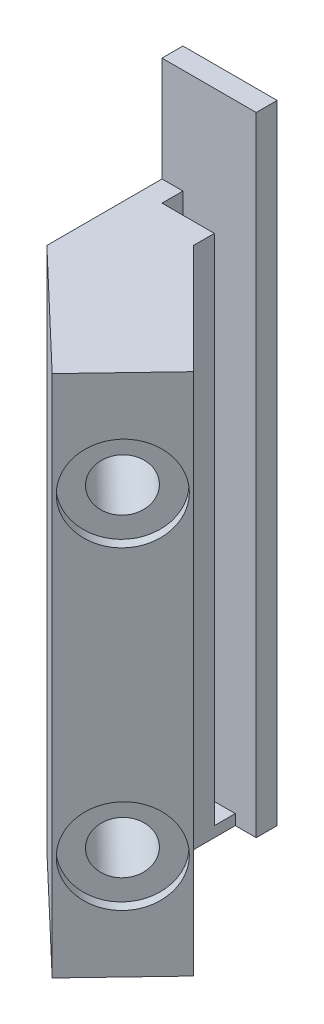
ISO-10303-21;
HEADER;
FILE_DESCRIPTION(('STEP AP214'),'2;1');
FILE_NAME('part.step','',(''),(''),'','','');
FILE_SCHEMA(('AUTOMOTIVE_DESIGN { 1 0 10303 214 1 1 1 1 }'));
ENDSEC;
DATA;
#1=APPLICATION_CONTEXT('core data for automotive mechanical design processes');
#2=APPLICATION_PROTOCOL_DEFINITION('international standard','automotive_design',2000,#1);
#3=PRODUCT_CONTEXT('',#1,'mechanical');
#4=PRODUCT('Part','Part','',(#3));
#5=PRODUCT_RELATED_PRODUCT_CATEGORY('part','',(#4));
#6=PRODUCT_DEFINITION_FORMATION('','',#4);
#7=PRODUCT_DEFINITION_CONTEXT('part definition',#1,'design');
#8=PRODUCT_DEFINITION('design','',#6,#7);
#9=PRODUCT_DEFINITION_SHAPE('','',#8);
#10=(LENGTH_UNIT() NAMED_UNIT(*) SI_UNIT(.MILLI.,.METRE.));
#11=(NAMED_UNIT(*) PLANE_ANGLE_UNIT() SI_UNIT($,.RADIAN.));
#12=(NAMED_UNIT(*) SI_UNIT($,.STERADIAN.) SOLID_ANGLE_UNIT());
#13=UNCERTAINTY_MEASURE_WITH_UNIT(LENGTH_MEASURE(1.E-05),#10,'distance_accuracy_value','');
#14=(GEOMETRIC_REPRESENTATION_CONTEXT(3) GLOBAL_UNCERTAINTY_ASSIGNED_CONTEXT((#13)) GLOBAL_UNIT_ASSIGNED_CONTEXT((#10,
#11,#12)) REPRESENTATION_CONTEXT('',''));
#15=CARTESIAN_POINT('',(0.,0.,0.));
#16=DIRECTION('',(0.,0.,1.));
#17=DIRECTION('',(1.,0.,0.));
#18=AXIS2_PLACEMENT_3D('',#15,#16,#17);
#19=CARTESIAN_POINT('',(0.,50.,0.));
#20=DIRECTION('',(0.,-1.,0.));
#21=DIRECTION('',(0.,0.,-1.));
#22=AXIS2_PLACEMENT_3D('',#19,#20,#21);
#23=PLANE('',#22);
#24=DIRECTION('',(1.,0.,0.));
#25=VECTOR('',#24,1.);
#26=CARTESIAN_POINT('',(9.,50.,2.));
#27=LINE('',#26,#25);
#28=CARTESIAN_POINT('',(0.,50.,2.));
#29=VERTEX_POINT('',#28);
#30=CARTESIAN_POINT('',(2.,50.,2.));
#31=VERTEX_POINT('',#30);
#32=EDGE_CURVE('E180',#29,#31,#27,.T.);
#33=ORIENTED_EDGE('',*,*,#32,.F.);
#34=DIRECTION('',(0.,0.,1.));
#35=VECTOR('',#34,1.);
#36=CARTESIAN_POINT('',(0.,50.,0.));
#37=LINE('',#36,#35);
#38=CARTESIAN_POINT('',(0.,50.,13.));
#39=VERTEX_POINT('',#38);
#40=EDGE_CURVE('E200',#29,#39,#37,.T.);
#41=ORIENTED_EDGE('',*,*,#40,.T.);
#42=DIRECTION('',(0.723861574835143,0.,0.689945230056116));
#43=VECTOR('',#42,1.);
#44=CARTESIAN_POINT('',(-6.4925229301194,50.,6.81168253379658));
#45=LINE('',#44,#43);
#46=CARTESIAN_POINT('',(10.8579236225271,50.,23.3491784508417));
#47=VERTEX_POINT('',#46);
#48=EDGE_CURVE('E163',#39,#47,#45,.T.);
#49=ORIENTED_EDGE('',*,*,#48,.T.);
#50=DIRECTION('',(0.689945230056116,0.,-0.723861574835143));
#51=VECTOR('',#50,1.);
#52=CARTESIAN_POINT('',(17.3504465526465,50.,16.5374959170452));
#53=LINE('',#52,#51);
#54=CARTESIAN_POINT('',(17.4417276359638,50.,16.4417276359639));
#55=VERTEX_POINT('',#54);
#56=EDGE_CURVE('E160',#47,#55,#53,.T.);
#57=ORIENTED_EDGE('',*,*,#56,.T.);
#58=DIRECTION('',(-0.707106781186548,0.,-0.707106781186548));
#59=VECTOR('',#58,1.);
#60=CARTESIAN_POINT('',(0.500000000000001,50.,-0.500000000000001));
#61=LINE('',#60,#59);
#62=CARTESIAN_POINT('',(7.,50.,6.));
#63=VERTEX_POINT('',#62);
#64=EDGE_CURVE('E157',#55,#63,#61,.T.);
#65=ORIENTED_EDGE('',*,*,#64,.T.);
#66=DIRECTION('',(0.,0.,-1.));
#67=VECTOR('',#66,1.);
#68=CARTESIAN_POINT('',(7.,50.,6.));
#69=LINE('',#68,#67);
#70=CARTESIAN_POINT('',(7.,50.,4.));
#71=VERTEX_POINT('',#70);
#72=EDGE_CURVE('E202',#63,#71,#69,.T.);
#73=ORIENTED_EDGE('',*,*,#72,.T.);
#74=DIRECTION('',(-1.,0.,0.));
#75=VECTOR('',#74,1.);
#76=CARTESIAN_POINT('',(7.,50.,4.));
#77=LINE('',#76,#75);
#78=CARTESIAN_POINT('',(2.,50.,4.));
#79=VERTEX_POINT('',#78);
#80=EDGE_CURVE('E204',#71,#79,#77,.T.);
#81=ORIENTED_EDGE('',*,*,#80,.T.);
#82=DIRECTION('',(0.,0.,-1.));
#83=VECTOR('',#82,1.);
#84=CARTESIAN_POINT('',(2.,50.,2.));
#85=LINE('',#84,#83);
#86=EDGE_CURVE('E206',#79,#31,#85,.T.);
#87=ORIENTED_EDGE('',*,*,#86,.T.);
#88=EDGE_LOOP('',(#33,#41,#49,#57,#65,#73,#81,#87));
#89=FACE_BOUND('',#88,.T.);
#90=ADVANCED_FACE('F35',(#89),#23,.F.);
#91=CARTESIAN_POINT('',(0.,50.,0.));
#92=DIRECTION('',(0.,0.,1.));
#93=DIRECTION('',(1.,0.,0.));
#94=AXIS2_PLACEMENT_3D('',#91,#92,#93);
#95=PLANE('',#94);
#96=CARTESIAN_POINT('',(5.5,55.,0.));
#97=DIRECTION('',(0.,0.,-1.));
#98=DIRECTION('',(-1.,0.,0.));
#99=AXIS2_PLACEMENT_3D('',#96,#97,#98);
#100=CIRCLE('',#99,3.15);
#101=CARTESIAN_POINT('',(2.35,55.,0.));
#102=VERTEX_POINT('',#101);
#103=EDGE_CURVE('E171',#102,#102,#100,.T.);
#104=ORIENTED_EDGE('',*,*,#103,.F.);
#105=EDGE_LOOP('',(#104));
#106=FACE_BOUND('',#105,.T.);
#107=DIRECTION('',(-1.,0.,0.));
#108=VECTOR('',#107,1.);
#109=CARTESIAN_POINT('',(0.,0.,0.));
#110=LINE('',#109,#108);
#111=CARTESIAN_POINT('',(9.,0.,0.));
#112=VERTEX_POINT('',#111);
#113=CARTESIAN_POINT('',(0.,0.,0.));
#114=VERTEX_POINT('',#113);
#115=EDGE_CURVE('E199',#112,#114,#110,.T.);
#116=ORIENTED_EDGE('',*,*,#115,.T.);
#117=DIRECTION('',(0.,-1.,0.));
#118=VECTOR('',#117,1.);
#119=CARTESIAN_POINT('',(0.,50.,0.));
#120=LINE('',#119,#118);
#121=CARTESIAN_POINT('',(0.,60.,0.));
#122=VERTEX_POINT('',#121);
#123=EDGE_CURVE('E11',#122,#114,#120,.T.);
#124=ORIENTED_EDGE('',*,*,#123,.F.);
#125=DIRECTION('',(-1.,0.,0.));
#126=VECTOR('',#125,1.);
#127=CARTESIAN_POINT('',(9.,60.,0.));
#128=LINE('',#127,#126);
#129=CARTESIAN_POINT('',(9.,60.,0.));
#130=VERTEX_POINT('',#129);
#131=EDGE_CURVE('E186',#130,#122,#128,.T.);
#132=ORIENTED_EDGE('',*,*,#131,.F.);
#133=DIRECTION('',(0.,-1.,0.));
#134=VECTOR('',#133,1.);
#135=CARTESIAN_POINT('',(9.,50.,0.));
#136=LINE('',#135,#134);
#137=EDGE_CURVE('E208',#130,#112,#136,.T.);
#138=ORIENTED_EDGE('',*,*,#137,.T.);
#139=EDGE_LOOP('',(#116,#124,#132,#138));
#140=FACE_BOUND('',#139,.T.);
#141=ADVANCED_FACE('F37',(#106,#140),#95,.F.);
#142=CARTESIAN_POINT('',(0.,50.,0.));
#143=DIRECTION('',(1.,0.,0.));
#144=DIRECTION('',(0.,0.,-1.));
#145=AXIS2_PLACEMENT_3D('',#142,#143,#144);
#146=PLANE('',#145);
#147=CARTESIAN_POINT('',(0.,40.,6.40861379344384));
#148=DIRECTION('',(1.,0.,0.));
#149=DIRECTION('',(0.,0.,1.));
#150=AXIS2_PLACEMENT_3D('',#147,#148,#149);
#151=ELLIPSE('',#150,3.45369900394198,2.5);
#152=CARTESIAN_POINT('',(0.,40.,9.86231279738581));
#153=VERTEX_POINT('',#152);
#154=EDGE_CURVE('E301',#153,#153,#151,.T.);
#155=ORIENTED_EDGE('',*,*,#154,.T.);
#156=EDGE_LOOP('',(#155));
#157=FACE_BOUND('',#156,.T.);
#158=CARTESIAN_POINT('',(0.,10.,6.40861379344383));
#159=DIRECTION('',(1.,0.,0.));
#160=DIRECTION('',(0.,0.,1.));
#161=AXIS2_PLACEMENT_3D('',#158,#159,#160);
#162=ELLIPSE('',#161,3.45369900394197,2.5);
#163=CARTESIAN_POINT('',(0.,10.,9.8623127973858));
#164=VERTEX_POINT('',#163);
#165=EDGE_CURVE('E304',#164,#164,#162,.T.);
#166=ORIENTED_EDGE('',*,*,#165,.T.);
#167=EDGE_LOOP('',(#166));
#168=FACE_BOUND('',#167,.T.);
#169=DIRECTION('',(0.,0.,1.));
#170=VECTOR('',#169,1.);
#171=CARTESIAN_POINT('',(0.,0.,0.));
#172=LINE('',#171,#170);
#173=CARTESIAN_POINT('',(0.,0.,13.));
#174=VERTEX_POINT('',#173);
#175=EDGE_CURVE('E136',#114,#174,#172,.T.);
#176=ORIENTED_EDGE('',*,*,#175,.T.);
#177=DIRECTION('',(0.,-1.,0.));
#178=VECTOR('',#177,1.);
#179=CARTESIAN_POINT('',(0.,50.,13.));
#180=LINE('',#179,#178);
#181=EDGE_CURVE('E168',#39,#174,#180,.T.);
#182=ORIENTED_EDGE('',*,*,#181,.F.);
#183=ORIENTED_EDGE('',*,*,#40,.F.);
#184=DIRECTION('',(0.,-1.,0.));
#185=VECTOR('',#184,1.);
#186=CARTESIAN_POINT('',(0.,60.,2.));
#187=LINE('',#186,#185);
#188=CARTESIAN_POINT('',(0.,60.,2.));
#189=VERTEX_POINT('',#188);
#190=EDGE_CURVE('E194',#189,#29,#187,.T.);
#191=ORIENTED_EDGE('',*,*,#190,.F.);
#192=DIRECTION('',(0.,0.,1.));
#193=VECTOR('',#192,1.);
#194=CARTESIAN_POINT('',(0.,60.,2.));
#195=LINE('',#194,#193);
#196=EDGE_CURVE('E189',#122,#189,#195,.T.);
#197=ORIENTED_EDGE('',*,*,#196,.F.);
#198=ORIENTED_EDGE('',*,*,#123,.T.);
#199=EDGE_LOOP('',(#176,#182,#183,#191,#197,#198));
#200=FACE_BOUND('',#199,.T.);
#201=ADVANCED_FACE('F256',(#157,#168,#200),#146,.F.);
#202=CARTESIAN_POINT('',(7.,50.,6.));
#203=DIRECTION('',(-1.,0.,0.));
#204=DIRECTION('',(0.,0.,1.));
#205=AXIS2_PLACEMENT_3D('',#202,#203,#204);
#206=PLANE('',#205);
#207=DIRECTION('',(0.,0.,-1.));
#208=VECTOR('',#207,1.);
#209=CARTESIAN_POINT('',(7.,0.,6.));
#210=LINE('',#209,#208);
#211=CARTESIAN_POINT('',(7.,0.,6.));
#212=VERTEX_POINT('',#211);
#213=CARTESIAN_POINT('',(7.,0.,2.));
#214=VERTEX_POINT('',#213);
#215=EDGE_CURVE('E125',#212,#214,#210,.T.);
#216=ORIENTED_EDGE('',*,*,#215,.T.);
#217=DIRECTION('',(0.,-1.,0.));
#218=VECTOR('',#217,1.);
#219=CARTESIAN_POINT('',(7.,1.,2.));
#220=LINE('',#219,#218);
#221=CARTESIAN_POINT('',(7.,1.,2.));
#222=VERTEX_POINT('',#221);
#223=EDGE_CURVE('E129',#222,#214,#220,.T.);
#224=ORIENTED_EDGE('',*,*,#223,.F.);
#225=DIRECTION('',(0.,0.,1.));
#226=VECTOR('',#225,1.);
#227=CARTESIAN_POINT('',(7.,1.,2.));
#228=LINE('',#227,#226);
#229=CARTESIAN_POINT('',(7.,1.,4.));
#230=VERTEX_POINT('',#229);
#231=EDGE_CURVE('E153',#222,#230,#228,.T.);
#232=ORIENTED_EDGE('',*,*,#231,.T.);
#233=DIRECTION('',(0.,-1.,0.));
#234=VECTOR('',#233,1.);
#235=CARTESIAN_POINT('',(7.,50.,4.));
#236=LINE('',#235,#234);
#237=EDGE_CURVE('E50',#71,#230,#236,.T.);
#238=ORIENTED_EDGE('',*,*,#237,.F.);
#239=ORIENTED_EDGE('',*,*,#72,.F.);
#240=DIRECTION('',(0.,-1.,0.));
#241=VECTOR('',#240,1.);
#242=CARTESIAN_POINT('',(7.,50.,6.));
#243=LINE('',#242,#241);
#244=EDGE_CURVE('E43',#63,#212,#243,.T.);
#245=ORIENTED_EDGE('',*,*,#244,.T.);
#246=EDGE_LOOP('',(#216,#224,#232,#238,#239,#245));
#247=FACE_BOUND('',#246,.T.);
#248=ADVANCED_FACE('F127',(#247),#206,.F.);
#249=CARTESIAN_POINT('',(7.,50.,4.));
#250=DIRECTION('',(0.,0.,1.));
#251=DIRECTION('',(1.,0.,0.));
#252=AXIS2_PLACEMENT_3D('',#249,#250,#251);
#253=PLANE('',#252);
#254=ORIENTED_EDGE('',*,*,#237,.T.);
#255=DIRECTION('',(-1.,0.,0.));
#256=VECTOR('',#255,1.);
#257=CARTESIAN_POINT('',(2.,1.,4.));
#258=LINE('',#257,#256);
#259=CARTESIAN_POINT('',(2.,1.,4.));
#260=VERTEX_POINT('',#259);
#261=EDGE_CURVE('E55',#230,#260,#258,.T.);
#262=ORIENTED_EDGE('',*,*,#261,.T.);
#263=DIRECTION('',(0.,-1.,0.));
#264=VECTOR('',#263,1.);
#265=CARTESIAN_POINT('',(2.,50.,4.));
#266=LINE('',#265,#264);
#267=EDGE_CURVE('E219',#79,#260,#266,.T.);
#268=ORIENTED_EDGE('',*,*,#267,.F.);
#269=ORIENTED_EDGE('',*,*,#80,.F.);
#270=EDGE_LOOP('',(#254,#262,#268,#269));
#271=FACE_BOUND('',#270,.T.);
#272=ADVANCED_FACE('F238',(#271),#253,.F.);
#273=CARTESIAN_POINT('',(2.,50.,2.));
#274=DIRECTION('',(-1.,0.,0.));
#275=DIRECTION('',(0.,0.,1.));
#276=AXIS2_PLACEMENT_3D('',#273,#274,#275);
#277=PLANE('',#276);
#278=ORIENTED_EDGE('',*,*,#267,.T.);
#279=DIRECTION('',(0.,0.,-1.));
#280=VECTOR('',#279,1.);
#281=CARTESIAN_POINT('',(2.,1.,2.));
#282=LINE('',#281,#280);
#283=CARTESIAN_POINT('',(2.,1.,2.));
#284=VERTEX_POINT('',#283);
#285=EDGE_CURVE('E226',#260,#284,#282,.T.);
#286=ORIENTED_EDGE('',*,*,#285,.T.);
#287=DIRECTION('',(0.,-1.,0.));
#288=VECTOR('',#287,1.);
#289=CARTESIAN_POINT('',(2.,50.,2.));
#290=LINE('',#289,#288);
#291=EDGE_CURVE('E217',#31,#284,#290,.T.);
#292=ORIENTED_EDGE('',*,*,#291,.F.);
#293=ORIENTED_EDGE('',*,*,#86,.F.);
#294=EDGE_LOOP('',(#278,#286,#292,#293));
#295=FACE_BOUND('',#294,.T.);
#296=ADVANCED_FACE('F224',(#295),#277,.F.);
#297=CARTESIAN_POINT('',(9.,50.,2.));
#298=DIRECTION('',(0.,0.,-1.));
#299=DIRECTION('',(-1.,0.,0.));
#300=AXIS2_PLACEMENT_3D('',#297,#298,#299);
#301=PLANE('',#300);
#302=DIRECTION('',(1.,0.,0.));
#303=VECTOR('',#302,1.);
#304=CARTESIAN_POINT('',(2.,1.,2.));
#305=LINE('',#304,#303);
#306=EDGE_CURVE('E148',#284,#222,#305,.T.);
#307=ORIENTED_EDGE('',*,*,#306,.T.);
#308=ORIENTED_EDGE('',*,*,#223,.T.);
#309=DIRECTION('',(1.,0.,0.));
#310=VECTOR('',#309,1.);
#311=CARTESIAN_POINT('',(9.,0.,2.));
#312=LINE('',#311,#310);
#313=CARTESIAN_POINT('',(9.,0.,2.));
#314=VERTEX_POINT('',#313);
#315=EDGE_CURVE('E135',#214,#314,#312,.T.);
#316=ORIENTED_EDGE('',*,*,#315,.T.);
#317=DIRECTION('',(0.,-1.,0.));
#318=VECTOR('',#317,1.);
#319=CARTESIAN_POINT('',(9.,50.,2.));
#320=LINE('',#319,#318);
#321=CARTESIAN_POINT('',(9.,60.,2.));
#322=VERTEX_POINT('',#321);
#323=EDGE_CURVE('E215',#322,#314,#320,.T.);
#324=ORIENTED_EDGE('',*,*,#323,.F.);
#325=DIRECTION('',(1.,0.,0.));
#326=VECTOR('',#325,1.);
#327=CARTESIAN_POINT('',(9.,60.,2.));
#328=LINE('',#327,#326);
#329=EDGE_CURVE('E191',#189,#322,#328,.T.);
#330=ORIENTED_EDGE('',*,*,#329,.F.);
#331=ORIENTED_EDGE('',*,*,#190,.T.);
#332=ORIENTED_EDGE('',*,*,#32,.T.);
#333=ORIENTED_EDGE('',*,*,#291,.T.);
#334=EDGE_LOOP('',(#307,#308,#316,#324,#330,#331,#332,#333));
#335=FACE_BOUND('',#334,.T.);
#336=ADVANCED_FACE('F145',(#335),#301,.F.);
#337=CARTESIAN_POINT('',(9.,50.,0.));
#338=DIRECTION('',(-1.,0.,0.));
#339=DIRECTION('',(0.,0.,1.));
#340=AXIS2_PLACEMENT_3D('',#337,#338,#339);
#341=PLANE('',#340);
#342=DIRECTION('',(0.,0.,-1.));
#343=VECTOR('',#342,1.);
#344=CARTESIAN_POINT('',(9.,0.,0.));
#345=LINE('',#344,#343);
#346=EDGE_CURVE('E141',#314,#112,#345,.T.);
#347=ORIENTED_EDGE('',*,*,#346,.T.);
#348=ORIENTED_EDGE('',*,*,#137,.F.);
#349=DIRECTION('',(0.,0.,-1.));
#350=VECTOR('',#349,1.);
#351=CARTESIAN_POINT('',(9.,60.,2.));
#352=LINE('',#351,#350);
#353=EDGE_CURVE('E183',#322,#130,#352,.T.);
#354=ORIENTED_EDGE('',*,*,#353,.F.);
#355=ORIENTED_EDGE('',*,*,#323,.T.);
#356=EDGE_LOOP('',(#347,#348,#354,#355));
#357=FACE_BOUND('',#356,.T.);
#358=ADVANCED_FACE('F263',(#357),#341,.F.);
#359=CARTESIAN_POINT('',(0.,0.,0.));
#360=DIRECTION('',(0.,-1.,0.));
#361=DIRECTION('',(0.,0.,-1.));
#362=AXIS2_PLACEMENT_3D('',#359,#360,#361);
#363=PLANE('',#362);
#364=ORIENTED_EDGE('',*,*,#115,.F.);
#365=ORIENTED_EDGE('',*,*,#346,.F.);
#366=ORIENTED_EDGE('',*,*,#315,.F.);
#367=ORIENTED_EDGE('',*,*,#215,.F.);
#368=DIRECTION('',(-0.707106781186548,0.,-0.707106781186548));
#369=VECTOR('',#368,1.);
#370=CARTESIAN_POINT('',(0.500000000000001,0.,-0.500000000000001));
#371=LINE('',#370,#369);
#372=CARTESIAN_POINT('',(17.4417276359638,0.,16.4417276359639));
#373=VERTEX_POINT('',#372);
#374=EDGE_CURVE('E149',#373,#212,#371,.T.);
#375=ORIENTED_EDGE('',*,*,#374,.F.);
#376=DIRECTION('',(0.689945230056116,0.,-0.723861574835143));
#377=VECTOR('',#376,1.);
#378=CARTESIAN_POINT('',(17.3504465526465,0.,16.5374959170452));
#379=LINE('',#378,#377);
#380=CARTESIAN_POINT('',(10.8579236225271,0.,23.3491784508417));
#381=VERTEX_POINT('',#380);
#382=EDGE_CURVE('E151',#381,#373,#379,.T.);
#383=ORIENTED_EDGE('',*,*,#382,.F.);
#384=DIRECTION('',(0.723861574835143,0.,0.689945230056116));
#385=VECTOR('',#384,1.);
#386=CARTESIAN_POINT('',(-6.4925229301194,0.,6.81168253379658));
#387=LINE('',#386,#385);
#388=EDGE_CURVE('E161',#174,#381,#387,.T.);
#389=ORIENTED_EDGE('',*,*,#388,.F.);
#390=ORIENTED_EDGE('',*,*,#175,.F.);
#391=EDGE_LOOP('',(#364,#365,#366,#367,#375,#383,#389,#390));
#392=FACE_BOUND('',#391,.T.);
#393=ADVANCED_FACE('F140',(#392),#363,.T.);
#394=CARTESIAN_POINT('',(0.,60.,0.));
#395=DIRECTION('',(0.,1.,0.));
#396=DIRECTION('',(0.,0.,1.));
#397=AXIS2_PLACEMENT_3D('',#394,#395,#396);
#398=PLANE('',#397);
#399=ORIENTED_EDGE('',*,*,#353,.T.);
#400=ORIENTED_EDGE('',*,*,#131,.T.);
#401=ORIENTED_EDGE('',*,*,#196,.T.);
#402=ORIENTED_EDGE('',*,*,#329,.T.);
#403=EDGE_LOOP('',(#399,#400,#401,#402));
#404=FACE_BOUND('',#403,.T.);
#405=ADVANCED_FACE('F266',(#404),#398,.T.);
#406=CARTESIAN_POINT('',(5.5,55.,1.));
#407=DIRECTION('',(0.,0.,-1.));
#408=DIRECTION('',(-1.,0.,0.));
#409=AXIS2_PLACEMENT_3D('',#406,#407,#408);
#410=CYLINDRICAL_SURFACE('',#409,3.15);
#411=CARTESIAN_POINT('',(5.5,55.,1.));
#412=DIRECTION('',(0.,0.,-1.));
#413=DIRECTION('',(-1.,0.,0.));
#414=AXIS2_PLACEMENT_3D('',#411,#412,#413);
#415=CIRCLE('',#414,3.15);
#416=CARTESIAN_POINT('',(2.35,55.,1.));
#417=VERTEX_POINT('',#416);
#418=EDGE_CURVE('E177',#417,#417,#415,.T.);
#419=ORIENTED_EDGE('',*,*,#418,.F.);
#420=EDGE_LOOP('',(#419));
#421=FACE_BOUND('',#420,.T.);
#422=ORIENTED_EDGE('',*,*,#103,.T.);
#423=EDGE_LOOP('',(#422));
#424=FACE_BOUND('',#423,.T.);
#425=ADVANCED_FACE('F268',(#421,#424),#410,.F.);
#426=CARTESIAN_POINT('',(5.5,55.,1.));
#427=DIRECTION('',(0.,0.,-1.));
#428=DIRECTION('',(-1.,0.,0.));
#429=AXIS2_PLACEMENT_3D('',#426,#427,#428);
#430=PLANE('',#429);
#431=ORIENTED_EDGE('',*,*,#418,.T.);
#432=EDGE_LOOP('',(#431));
#433=FACE_BOUND('',#432,.T.);
#434=ADVANCED_FACE('F274',(#433),#430,.T.);
#435=CARTESIAN_POINT('',(0.500000000000001,50.,-0.500000000000001));
#436=DIRECTION('',(-0.707106781186548,0.,0.707106781186548));
#437=DIRECTION('',(0.707106781186548,0.,0.707106781186548));
#438=AXIS2_PLACEMENT_3D('',#435,#436,#437);
#439=PLANE('',#438);
#440=ORIENTED_EDGE('',*,*,#374,.T.);
#441=ORIENTED_EDGE('',*,*,#244,.F.);
#442=ORIENTED_EDGE('',*,*,#64,.F.);
#443=DIRECTION('',(0.,-1.,0.));
#444=VECTOR('',#443,1.);
#445=CARTESIAN_POINT('',(17.4417276359638,50.,16.4417276359639));
#446=LINE('',#445,#444);
#447=EDGE_CURVE('E164',#55,#373,#446,.T.);
#448=ORIENTED_EDGE('',*,*,#447,.T.);
#449=EDGE_LOOP('',(#440,#441,#442,#448));
#450=FACE_BOUND('',#449,.T.);
#451=ADVANCED_FACE('F244',(#450),#439,.F.);
#452=CARTESIAN_POINT('',(-6.4925229301194,50.,6.81168253379658));
#453=DIRECTION('',(0.689945230056116,0.,-0.723861574835143));
#454=DIRECTION('',(-0.723861574835143,0.,-0.689945230056116));
#455=AXIS2_PLACEMENT_3D('',#452,#453,#454);
#456=PLANE('',#455);
#457=ORIENTED_EDGE('',*,*,#388,.T.);
#458=DIRECTION('',(0.,-1.,0.));
#459=VECTOR('',#458,1.);
#460=CARTESIAN_POINT('',(10.8579236225271,50.,23.3491784508417));
#461=LINE('',#460,#459);
#462=EDGE_CURVE('E172',#47,#381,#461,.T.);
#463=ORIENTED_EDGE('',*,*,#462,.F.);
#464=ORIENTED_EDGE('',*,*,#48,.F.);
#465=ORIENTED_EDGE('',*,*,#181,.T.);
#466=EDGE_LOOP('',(#457,#463,#464,#465));
#467=FACE_BOUND('',#466,.T.);
#468=ADVANCED_FACE('F252',(#467),#456,.F.);
#469=CARTESIAN_POINT('',(17.3504465526465,50.,16.5374959170452));
#470=DIRECTION('',(-0.723861574835143,0.,-0.689945230056116));
#471=DIRECTION('',(-0.689945230056116,0.,0.723861574835143));
#472=AXIS2_PLACEMENT_3D('',#469,#470,#471);
#473=PLANE('',#472);
#474=CARTESIAN_POINT('',(14.1498256292455,40.,19.8954530434028));
#475=DIRECTION('',(0.723861574835143,0.,0.689945230056116));
#476=DIRECTION('',(0.689945230056116,0.,-0.723861574835143));
#477=AXIS2_PLACEMENT_3D('',#474,#475,#476);
#478=CIRCLE('',#477,4.5);
#479=CARTESIAN_POINT('',(17.254579164498,40.,16.6380759566447));
#480=VERTEX_POINT('',#479);
#481=EDGE_CURVE('E233',#480,#480,#478,.T.);
#482=ORIENTED_EDGE('',*,*,#481,.F.);
#483=EDGE_LOOP('',(#482));
#484=FACE_BOUND('',#483,.T.);
#485=CARTESIAN_POINT('',(14.1498256292455,10.,19.8954530434028));
#486=DIRECTION('',(0.723861574835143,0.,0.689945230056116));
#487=DIRECTION('',(0.689945230056116,0.,-0.723861574835143));
#488=AXIS2_PLACEMENT_3D('',#485,#486,#487);
#489=CIRCLE('',#488,4.5);
#490=CARTESIAN_POINT('',(17.254579164498,10.,16.6380759566446));
#491=VERTEX_POINT('',#490);
#492=EDGE_CURVE('E236',#491,#491,#489,.T.);
#493=ORIENTED_EDGE('',*,*,#492,.F.);
#494=EDGE_LOOP('',(#493));
#495=FACE_BOUND('',#494,.T.);
#496=ORIENTED_EDGE('',*,*,#382,.T.);
#497=ORIENTED_EDGE('',*,*,#447,.F.);
#498=ORIENTED_EDGE('',*,*,#56,.F.);
#499=ORIENTED_EDGE('',*,*,#462,.T.);
#500=EDGE_LOOP('',(#496,#497,#498,#499));
#501=FACE_BOUND('',#500,.T.);
#502=ADVANCED_FACE('F248',(#484,#495,#501),#473,.F.);
#503=CARTESIAN_POINT('',(0.,1.,0.));
#504=DIRECTION('',(0.,1.,0.));
#505=DIRECTION('',(0.,0.,1.));
#506=AXIS2_PLACEMENT_3D('',#503,#504,#505);
#507=PLANE('',#506);
#508=ORIENTED_EDGE('',*,*,#285,.F.);
#509=ORIENTED_EDGE('',*,*,#261,.F.);
#510=ORIENTED_EDGE('',*,*,#231,.F.);
#511=ORIENTED_EDGE('',*,*,#306,.F.);
#512=EDGE_LOOP('',(#508,#509,#510,#511));
#513=FACE_BOUND('',#512,.T.);
#514=ADVANCED_FACE('F228',(#513),#507,.T.);
#515=CARTESIAN_POINT('',(13.4259640544104,10.,19.2055078133467));
#516=DIRECTION('',(0.723861574835143,0.,0.689945230056116));
#517=DIRECTION('',(0.689945230056116,0.,-0.723861574835143));
#518=AXIS2_PLACEMENT_3D('',#515,#516,#517);
#519=CYLINDRICAL_SURFACE('',#518,4.5);
#520=CARTESIAN_POINT('',(13.4259640544104,10.,19.2055078133467));
#521=DIRECTION('',(0.723861574835143,0.,0.689945230056116));
#522=DIRECTION('',(0.689945230056116,0.,-0.723861574835143));
#523=AXIS2_PLACEMENT_3D('',#520,#521,#522);
#524=CIRCLE('',#523,4.5);
#525=CARTESIAN_POINT('',(16.5307175896629,10.,15.9481307265885));
#526=VERTEX_POINT('',#525);
#527=EDGE_CURVE('E309',#526,#526,#524,.T.);
#528=ORIENTED_EDGE('',*,*,#527,.F.);
#529=EDGE_LOOP('',(#528));
#530=FACE_BOUND('',#529,.T.);
#531=ORIENTED_EDGE('',*,*,#492,.T.);
#532=EDGE_LOOP('',(#531));
#533=FACE_BOUND('',#532,.T.);
#534=ADVANCED_FACE('F320',(#530,#533),#519,.F.);
#535=CARTESIAN_POINT('',(13.4259640544104,10.,19.2055078133467));
#536=DIRECTION('',(0.723861574835143,0.,0.689945230056116));
#537=DIRECTION('',(0.689945230056116,0.,-0.723861574835143));
#538=AXIS2_PLACEMENT_3D('',#535,#536,#537);
#539=PLANE('',#538);
#540=CARTESIAN_POINT('',(13.4259640544104,10.,19.2055078133467));
#541=DIRECTION('',(0.723861574835143,0.,0.689945230056116));
#542=DIRECTION('',(0.689945230056116,0.,-0.723861574835143));
#543=AXIS2_PLACEMENT_3D('',#540,#541,#542);
#544=CIRCLE('',#543,2.5);
#545=CARTESIAN_POINT('',(15.1508271295506,10.,17.3958538762588));
#546=VERTEX_POINT('',#545);
#547=EDGE_CURVE('E306',#546,#546,#544,.T.);
#548=ORIENTED_EDGE('',*,*,#547,.F.);
#549=EDGE_LOOP('',(#548));
#550=FACE_BOUND('',#549,.T.);
#551=ORIENTED_EDGE('',*,*,#527,.T.);
#552=EDGE_LOOP('',(#551));
#553=FACE_BOUND('',#552,.T.);
#554=ADVANCED_FACE('F318',(#550,#553),#539,.T.);
#555=CARTESIAN_POINT('',(13.4259640544104,40.,19.2055078133467));
#556=DIRECTION('',(0.723861574835143,0.,0.689945230056116));
#557=DIRECTION('',(0.689945230056116,0.,-0.723861574835143));
#558=AXIS2_PLACEMENT_3D('',#555,#556,#557);
#559=CYLINDRICAL_SURFACE('',#558,4.5);
#560=CARTESIAN_POINT('',(13.4259640544104,40.,19.2055078133467));
#561=DIRECTION('',(0.723861574835143,0.,0.689945230056116));
#562=DIRECTION('',(0.689945230056116,0.,-0.723861574835143));
#563=AXIS2_PLACEMENT_3D('',#560,#561,#562);
#564=CIRCLE('',#563,4.5);
#565=CARTESIAN_POINT('',(16.5307175896629,40.,15.9481307265885));
#566=VERTEX_POINT('',#565);
#567=EDGE_CURVE('E229',#566,#566,#564,.T.);
#568=ORIENTED_EDGE('',*,*,#567,.F.);
#569=EDGE_LOOP('',(#568));
#570=FACE_BOUND('',#569,.T.);
#571=ORIENTED_EDGE('',*,*,#481,.T.);
#572=EDGE_LOOP('',(#571));
#573=FACE_BOUND('',#572,.T.);
#574=ADVANCED_FACE('F416',(#570,#573),#559,.F.);
#575=CARTESIAN_POINT('',(13.4259640544104,40.,19.2055078133467));
#576=DIRECTION('',(0.723861574835143,0.,0.689945230056116));
#577=DIRECTION('',(0.689945230056116,0.,-0.723861574835143));
#578=AXIS2_PLACEMENT_3D('',#575,#576,#577);
#579=PLANE('',#578);
#580=CARTESIAN_POINT('',(13.4259640544104,40.,19.2055078133467));
#581=DIRECTION('',(0.723861574835143,0.,0.689945230056116));
#582=DIRECTION('',(0.689945230056116,0.,-0.723861574835143));
#583=AXIS2_PLACEMENT_3D('',#580,#581,#582);
#584=CIRCLE('',#583,2.5);
#585=CARTESIAN_POINT('',(15.1508271295506,40.,17.3958538762588));
#586=VERTEX_POINT('',#585);
#587=EDGE_CURVE('E470',#586,#586,#584,.T.);
#588=ORIENTED_EDGE('',*,*,#587,.F.);
#589=EDGE_LOOP('',(#588));
#590=FACE_BOUND('',#589,.T.);
#591=ORIENTED_EDGE('',*,*,#567,.T.);
#592=EDGE_LOOP('',(#591));
#593=FACE_BOUND('',#592,.T.);
#594=ADVANCED_FACE('F426',(#590,#593),#579,.T.);
#595=CARTESIAN_POINT('',(-3.20062092340105,40.,3.35795712635762));
#596=DIRECTION('',(0.723861574835143,0.,0.689945230056116));
#597=DIRECTION('',(0.689945230056116,0.,-0.723861574835143));
#598=AXIS2_PLACEMENT_3D('',#595,#596,#597);
#599=CYLINDRICAL_SURFACE('',#598,2.5);
#600=ORIENTED_EDGE('',*,*,#587,.T.);
#601=EDGE_LOOP('',(#600));
#602=FACE_BOUND('',#601,.T.);
#603=ORIENTED_EDGE('',*,*,#154,.F.);
#604=EDGE_LOOP('',(#603));
#605=FACE_BOUND('',#604,.T.);
#606=ADVANCED_FACE('F435',(#602,#605),#599,.F.);
#607=CARTESIAN_POINT('',(-3.20062092340104,10.,3.35795712635762));
#608=DIRECTION('',(0.723861574835143,0.,0.689945230056116));
#609=DIRECTION('',(0.689945230056116,0.,-0.723861574835143));
#610=AXIS2_PLACEMENT_3D('',#607,#608,#609);
#611=CYLINDRICAL_SURFACE('',#610,2.5);
#612=ORIENTED_EDGE('',*,*,#547,.T.);
#613=EDGE_LOOP('',(#612));
#614=FACE_BOUND('',#613,.T.);
#615=ORIENTED_EDGE('',*,*,#165,.F.);
#616=EDGE_LOOP('',(#615));
#617=FACE_BOUND('',#616,.T.);
#618=ADVANCED_FACE('F452',(#614,#617),#611,.F.);
#619=CLOSED_SHELL('',(#90,#141,#201,#248,#272,#296,#336,#358,#393,#405,#425,#434,#451,#468,#502,
#514,#534,#554,#574,#594,#606,#618));
#620=MANIFOLD_SOLID_BREP('B2',#619);
#621=ADVANCED_BREP_SHAPE_REPRESENTATION('',(#18,#620),#14);
#622=SHAPE_DEFINITION_REPRESENTATION(#9,#621);
ENDSEC;
END-ISO-10303-21;
